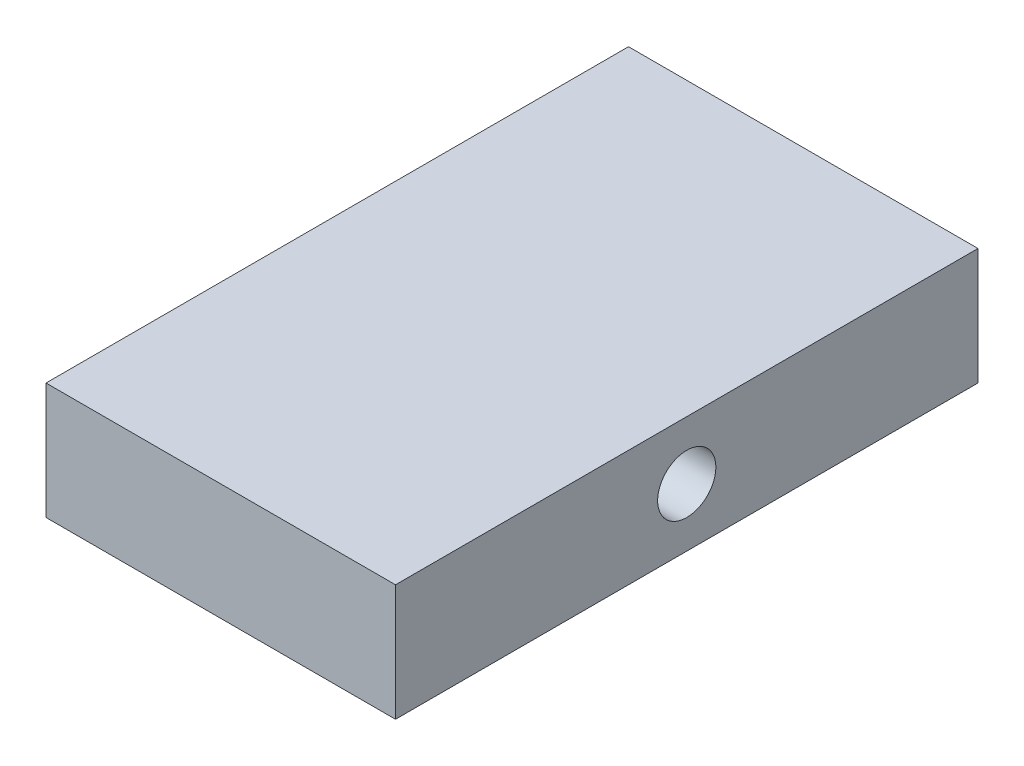
ISO-10303-21;
HEADER;
FILE_DESCRIPTION(('STEP AP214'),'2;1');
FILE_NAME('part.step','',(''),(''),'','','');
FILE_SCHEMA(('AUTOMOTIVE_DESIGN { 1 0 10303 214 1 1 1 1 }'));
ENDSEC;
DATA;
#1=APPLICATION_CONTEXT('core data for automotive mechanical design processes');
#2=APPLICATION_PROTOCOL_DEFINITION('international standard','automotive_design',2000,#1);
#3=PRODUCT_CONTEXT('',#1,'mechanical');
#4=PRODUCT('Part','Part','',(#3));
#5=PRODUCT_RELATED_PRODUCT_CATEGORY('part','',(#4));
#6=PRODUCT_DEFINITION_FORMATION('','',#4);
#7=PRODUCT_DEFINITION_CONTEXT('part definition',#1,'design');
#8=PRODUCT_DEFINITION('design','',#6,#7);
#9=PRODUCT_DEFINITION_SHAPE('','',#8);
#10=(LENGTH_UNIT() NAMED_UNIT(*) SI_UNIT(.MILLI.,.METRE.));
#11=(NAMED_UNIT(*) PLANE_ANGLE_UNIT() SI_UNIT($,.RADIAN.));
#12=(NAMED_UNIT(*) SI_UNIT($,.STERADIAN.) SOLID_ANGLE_UNIT());
#13=UNCERTAINTY_MEASURE_WITH_UNIT(LENGTH_MEASURE(1.E-05),#10,'distance_accuracy_value','');
#14=(GEOMETRIC_REPRESENTATION_CONTEXT(3) GLOBAL_UNCERTAINTY_ASSIGNED_CONTEXT((#13)) GLOBAL_UNIT_ASSIGNED_CONTEXT((#10,
#11,#12)) REPRESENTATION_CONTEXT('',''));
#15=CARTESIAN_POINT('',(0.,0.,0.));
#16=DIRECTION('',(0.,0.,1.));
#17=DIRECTION('',(1.,0.,0.));
#18=AXIS2_PLACEMENT_3D('',#15,#16,#17);
#19=CARTESIAN_POINT('',(76.2,-12.7,63.5));
#20=DIRECTION('',(0.,0.,-1.));
#21=DIRECTION('',(-1.,0.,0.));
#22=AXIS2_PLACEMENT_3D('',#19,#20,#21);
#23=PLANE('',#22);
#24=DIRECTION('',(0.,-1.,0.));
#25=VECTOR('',#24,1.);
#26=CARTESIAN_POINT('',(0.,-12.7,63.5));
#27=LINE('',#26,#25);
#28=CARTESIAN_POINT('',(0.,12.7,63.5));
#29=VERTEX_POINT('',#28);
#30=CARTESIAN_POINT('',(0.,-12.7,63.5));
#31=VERTEX_POINT('',#30);
#32=EDGE_CURVE('E96',#29,#31,#27,.T.);
#33=ORIENTED_EDGE('',*,*,#32,.T.);
#34=DIRECTION('',(-1.,0.,0.));
#35=VECTOR('',#34,1.);
#36=CARTESIAN_POINT('',(76.2,-12.7,63.5));
#37=LINE('',#36,#35);
#38=CARTESIAN_POINT('',(76.2,-12.7,63.5));
#39=VERTEX_POINT('',#38);
#40=EDGE_CURVE('E11',#39,#31,#37,.T.);
#41=ORIENTED_EDGE('',*,*,#40,.F.);
#42=DIRECTION('',(0.,-1.,0.));
#43=VECTOR('',#42,1.);
#44=CARTESIAN_POINT('',(76.2,-12.7,63.5));
#45=LINE('',#44,#43);
#46=CARTESIAN_POINT('',(76.2,12.7,63.5));
#47=VERTEX_POINT('',#46);
#48=EDGE_CURVE('E84',#47,#39,#45,.T.);
#49=ORIENTED_EDGE('',*,*,#48,.F.);
#50=DIRECTION('',(-1.,0.,0.));
#51=VECTOR('',#50,1.);
#52=CARTESIAN_POINT('',(76.2,12.7,63.5));
#53=LINE('',#52,#51);
#54=EDGE_CURVE('E92',#47,#29,#53,.T.);
#55=ORIENTED_EDGE('',*,*,#54,.T.);
#56=EDGE_LOOP('',(#33,#41,#49,#55));
#57=FACE_BOUND('',#56,.T.);
#58=ADVANCED_FACE('F33',(#57),#23,.F.);
#59=CARTESIAN_POINT('',(76.2,-12.7,-63.5));
#60=DIRECTION('',(0.,1.,0.));
#61=DIRECTION('',(0.,0.,1.));
#62=AXIS2_PLACEMENT_3D('',#59,#60,#61);
#63=PLANE('',#62);
#64=DIRECTION('',(0.,0.,-1.));
#65=VECTOR('',#64,1.);
#66=CARTESIAN_POINT('',(0.,-12.7,-63.5));
#67=LINE('',#66,#65);
#68=CARTESIAN_POINT('',(0.,-12.7,-63.5));
#69=VERTEX_POINT('',#68);
#70=EDGE_CURVE('E88',#31,#69,#67,.T.);
#71=ORIENTED_EDGE('',*,*,#70,.T.);
#72=DIRECTION('',(-1.,0.,0.));
#73=VECTOR('',#72,1.);
#74=CARTESIAN_POINT('',(76.2,-12.7,-63.5));
#75=LINE('',#74,#73);
#76=CARTESIAN_POINT('',(76.2,-12.7,-63.5));
#77=VERTEX_POINT('',#76);
#78=EDGE_CURVE('E41',#77,#69,#75,.T.);
#79=ORIENTED_EDGE('',*,*,#78,.F.);
#80=DIRECTION('',(0.,0.,-1.));
#81=VECTOR('',#80,1.);
#82=CARTESIAN_POINT('',(76.2,-12.7,-63.5));
#83=LINE('',#82,#81);
#84=EDGE_CURVE('E79',#39,#77,#83,.T.);
#85=ORIENTED_EDGE('',*,*,#84,.F.);
#86=ORIENTED_EDGE('',*,*,#40,.T.);
#87=EDGE_LOOP('',(#71,#79,#85,#86));
#88=FACE_BOUND('',#87,.T.);
#89=ADVANCED_FACE('F87',(#88),#63,.F.);
#90=CARTESIAN_POINT('',(76.2,-12.7,-63.5));
#91=DIRECTION('',(0.,0.,1.));
#92=DIRECTION('',(1.,0.,0.));
#93=AXIS2_PLACEMENT_3D('',#90,#91,#92);
#94=PLANE('',#93);
#95=DIRECTION('',(0.,1.,0.));
#96=VECTOR('',#95,1.);
#97=CARTESIAN_POINT('',(0.,-12.7,-63.5));
#98=LINE('',#97,#96);
#99=CARTESIAN_POINT('',(0.,12.7,-63.5));
#100=VERTEX_POINT('',#99);
#101=EDGE_CURVE('E66',#69,#100,#98,.T.);
#102=ORIENTED_EDGE('',*,*,#101,.T.);
#103=DIRECTION('',(-1.,0.,0.));
#104=VECTOR('',#103,1.);
#105=CARTESIAN_POINT('',(76.2,12.7,-63.5));
#106=LINE('',#105,#104);
#107=CARTESIAN_POINT('',(76.2,12.7,-63.5));
#108=VERTEX_POINT('',#107);
#109=EDGE_CURVE('E89',#108,#100,#106,.T.);
#110=ORIENTED_EDGE('',*,*,#109,.F.);
#111=DIRECTION('',(0.,1.,0.));
#112=VECTOR('',#111,1.);
#113=CARTESIAN_POINT('',(76.2,-12.7,-63.5));
#114=LINE('',#113,#112);
#115=EDGE_CURVE('E82',#77,#108,#114,.T.);
#116=ORIENTED_EDGE('',*,*,#115,.F.);
#117=ORIENTED_EDGE('',*,*,#78,.T.);
#118=EDGE_LOOP('',(#102,#110,#116,#117));
#119=FACE_BOUND('',#118,.T.);
#120=ADVANCED_FACE('F90',(#119),#94,.F.);
#121=CARTESIAN_POINT('',(76.2,12.7,-63.5));
#122=DIRECTION('',(0.,-1.,0.));
#123=DIRECTION('',(0.,0.,-1.));
#124=AXIS2_PLACEMENT_3D('',#121,#122,#123);
#125=PLANE('',#124);
#126=DIRECTION('',(0.,0.,1.));
#127=VECTOR('',#126,1.);
#128=CARTESIAN_POINT('',(0.,12.7,-63.5));
#129=LINE('',#128,#127);
#130=EDGE_CURVE('E72',#100,#29,#129,.T.);
#131=ORIENTED_EDGE('',*,*,#130,.T.);
#132=ORIENTED_EDGE('',*,*,#54,.F.);
#133=DIRECTION('',(0.,0.,1.));
#134=VECTOR('',#133,1.);
#135=CARTESIAN_POINT('',(76.2,12.7,-63.5));
#136=LINE('',#135,#134);
#137=EDGE_CURVE('E49',#108,#47,#136,.T.);
#138=ORIENTED_EDGE('',*,*,#137,.F.);
#139=ORIENTED_EDGE('',*,*,#109,.T.);
#140=EDGE_LOOP('',(#131,#132,#138,#139));
#141=FACE_BOUND('',#140,.T.);
#142=ADVANCED_FACE('F104',(#141),#125,.F.);
#143=CARTESIAN_POINT('',(76.2,0.,0.));
#144=DIRECTION('',(1.,0.,0.));
#145=DIRECTION('',(0.,0.,-1.));
#146=AXIS2_PLACEMENT_3D('',#143,#144,#145);
#147=PLANE('',#146);
#148=CARTESIAN_POINT('',(76.2,0.,0.));
#149=DIRECTION('',(1.,0.,0.));
#150=DIRECTION('',(0.,0.,-1.));
#151=AXIS2_PLACEMENT_3D('',#148,#149,#150);
#152=CIRCLE('',#151,6.35);
#153=CARTESIAN_POINT('',(76.2,0.,-6.35));
#154=VERTEX_POINT('',#153);
#155=EDGE_CURVE('E110',#154,#154,#152,.T.);
#156=ORIENTED_EDGE('',*,*,#155,.F.);
#157=EDGE_LOOP('',(#156));
#158=FACE_BOUND('',#157,.T.);
#159=ORIENTED_EDGE('',*,*,#48,.T.);
#160=ORIENTED_EDGE('',*,*,#84,.T.);
#161=ORIENTED_EDGE('',*,*,#115,.T.);
#162=ORIENTED_EDGE('',*,*,#137,.T.);
#163=EDGE_LOOP('',(#159,#160,#161,#162));
#164=FACE_BOUND('',#163,.T.);
#165=ADVANCED_FACE('F80',(#158,#164),#147,.T.);
#166=CARTESIAN_POINT('',(0.,0.,0.));
#167=DIRECTION('',(1.,0.,0.));
#168=DIRECTION('',(0.,0.,-1.));
#169=AXIS2_PLACEMENT_3D('',#166,#167,#168);
#170=PLANE('',#169);
#171=ORIENTED_EDGE('',*,*,#32,.F.);
#172=ORIENTED_EDGE('',*,*,#130,.F.);
#173=ORIENTED_EDGE('',*,*,#101,.F.);
#174=ORIENTED_EDGE('',*,*,#70,.F.);
#175=EDGE_LOOP('',(#171,#172,#173,#174));
#176=FACE_BOUND('',#175,.T.);
#177=ADVANCED_FACE('F107',(#176),#170,.F.);
#178=CARTESIAN_POINT('',(12.7,0.,0.));
#179=DIRECTION('',(1.,0.,0.));
#180=DIRECTION('',(0.,0.,-1.));
#181=AXIS2_PLACEMENT_3D('',#178,#179,#180);
#182=CYLINDRICAL_SURFACE('',#181,6.35);
#183=CARTESIAN_POINT('',(12.7,0.,0.));
#184=DIRECTION('',(1.,0.,0.));
#185=DIRECTION('',(0.,0.,-1.));
#186=AXIS2_PLACEMENT_3D('',#183,#184,#185);
#187=CIRCLE('',#186,6.35);
#188=CARTESIAN_POINT('',(12.7,0.,-6.35));
#189=VERTEX_POINT('',#188);
#190=EDGE_CURVE('E99',#189,#189,#187,.T.);
#191=ORIENTED_EDGE('',*,*,#190,.F.);
#192=EDGE_LOOP('',(#191));
#193=FACE_BOUND('',#192,.T.);
#194=ORIENTED_EDGE('',*,*,#155,.T.);
#195=EDGE_LOOP('',(#194));
#196=FACE_BOUND('',#195,.T.);
#197=ADVANCED_FACE('F118',(#193,#196),#182,.F.);
#198=CARTESIAN_POINT('',(12.7,0.,0.));
#199=DIRECTION('',(1.,0.,0.));
#200=DIRECTION('',(0.,0.,-1.));
#201=AXIS2_PLACEMENT_3D('',#198,#199,#200);
#202=PLANE('',#201);
#203=ORIENTED_EDGE('',*,*,#190,.T.);
#204=EDGE_LOOP('',(#203));
#205=FACE_BOUND('',#204,.T.);
#206=ADVANCED_FACE('F116',(#205),#202,.T.);
#207=CLOSED_SHELL('',(#58,#89,#120,#142,#165,#177,#197,#206));
#208=MANIFOLD_SOLID_BREP('B2',#207);
#209=ADVANCED_BREP_SHAPE_REPRESENTATION('',(#18,#208),#14);
#210=SHAPE_DEFINITION_REPRESENTATION(#9,#209);
ENDSEC;
END-ISO-10303-21;
